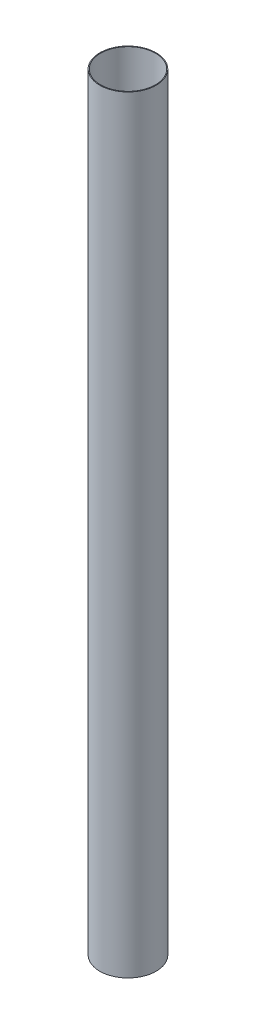
ISO-10303-21;
HEADER;
FILE_DESCRIPTION(('STEP AP214'),'2;1');
FILE_NAME('part.step','',(''),(''),'','','');
FILE_SCHEMA(('AUTOMOTIVE_DESIGN { 1 0 10303 214 1 1 1 1 }'));
ENDSEC;
DATA;
#1=APPLICATION_CONTEXT('core data for automotive mechanical design processes');
#2=APPLICATION_PROTOCOL_DEFINITION('international standard','automotive_design',2000,#1);
#3=PRODUCT_CONTEXT('',#1,'mechanical');
#4=PRODUCT('Part','Part','',(#3));
#5=PRODUCT_RELATED_PRODUCT_CATEGORY('part','',(#4));
#6=PRODUCT_DEFINITION_FORMATION('','',#4);
#7=PRODUCT_DEFINITION_CONTEXT('part definition',#1,'design');
#8=PRODUCT_DEFINITION('design','',#6,#7);
#9=PRODUCT_DEFINITION_SHAPE('','',#8);
#10=(LENGTH_UNIT() NAMED_UNIT(*) SI_UNIT(.MILLI.,.METRE.));
#11=(NAMED_UNIT(*) PLANE_ANGLE_UNIT() SI_UNIT($,.RADIAN.));
#12=(NAMED_UNIT(*) SI_UNIT($,.STERADIAN.) SOLID_ANGLE_UNIT());
#13=UNCERTAINTY_MEASURE_WITH_UNIT(LENGTH_MEASURE(1.E-05),#10,'distance_accuracy_value','');
#14=(GEOMETRIC_REPRESENTATION_CONTEXT(3) GLOBAL_UNCERTAINTY_ASSIGNED_CONTEXT((#13)) GLOBAL_UNIT_ASSIGNED_CONTEXT((#10,
#11,#12)) REPRESENTATION_CONTEXT('',''));
#15=CARTESIAN_POINT('',(0.,0.,0.));
#16=DIRECTION('',(0.,0.,1.));
#17=DIRECTION('',(1.,0.,0.));
#18=AXIS2_PLACEMENT_3D('',#15,#16,#17);
#19=CARTESIAN_POINT('',(0.,2133.6,0.));
#20=DIRECTION('',(0.,1.,0.));
#21=DIRECTION('',(0.,0.,1.));
#22=AXIS2_PLACEMENT_3D('',#19,#20,#21);
#23=PLANE('',#22);
#24=CARTESIAN_POINT('',(0.,2133.6,0.));
#25=DIRECTION('',(0.,1.,0.));
#26=DIRECTION('',(0.,0.,1.));
#27=AXIS2_PLACEMENT_3D('',#24,#25,#26);
#28=CIRCLE('',#27,78.359);
#29=CARTESIAN_POINT('',(0.,2133.6,78.359));
#30=VERTEX_POINT('',#29);
#31=EDGE_CURVE('E10',#30,#30,#28,.T.);
#32=ORIENTED_EDGE('',*,*,#31,.T.);
#33=EDGE_LOOP('',(#32));
#34=FACE_BOUND('',#33,.T.);
#35=CARTESIAN_POINT('',(0.,2133.6,0.));
#36=DIRECTION('',(0.,1.,0.));
#37=DIRECTION('',(0.,0.,1.));
#38=AXIS2_PLACEMENT_3D('',#35,#36,#37);
#39=CIRCLE('',#38,76.2);
#40=CARTESIAN_POINT('',(0.,2133.6,76.2));
#41=VERTEX_POINT('',#40);
#42=EDGE_CURVE('E43',#41,#41,#39,.T.);
#43=ORIENTED_EDGE('',*,*,#42,.F.);
#44=EDGE_LOOP('',(#43));
#45=FACE_BOUND('',#44,.T.);
#46=ADVANCED_FACE('F32',(#34,#45),#23,.T.);
#47=CARTESIAN_POINT('',(0.,0.,0.));
#48=DIRECTION('',(0.,1.,0.));
#49=DIRECTION('',(0.,0.,1.));
#50=AXIS2_PLACEMENT_3D('',#47,#48,#49);
#51=PLANE('',#50);
#52=CARTESIAN_POINT('',(0.,0.,0.));
#53=DIRECTION('',(0.,1.,0.));
#54=DIRECTION('',(0.,0.,1.));
#55=AXIS2_PLACEMENT_3D('',#52,#53,#54);
#56=CIRCLE('',#55,78.359);
#57=CARTESIAN_POINT('',(0.,0.,78.359));
#58=VERTEX_POINT('',#57);
#59=EDGE_CURVE('E36',#58,#58,#56,.T.);
#60=ORIENTED_EDGE('',*,*,#59,.F.);
#61=EDGE_LOOP('',(#60));
#62=FACE_BOUND('',#61,.T.);
#63=CARTESIAN_POINT('',(0.,0.,0.));
#64=DIRECTION('',(0.,1.,0.));
#65=DIRECTION('',(0.,0.,1.));
#66=AXIS2_PLACEMENT_3D('',#63,#64,#65);
#67=CIRCLE('',#66,76.2);
#68=CARTESIAN_POINT('',(0.,0.,76.2));
#69=VERTEX_POINT('',#68);
#70=EDGE_CURVE('E45',#69,#69,#67,.T.);
#71=ORIENTED_EDGE('',*,*,#70,.T.);
#72=EDGE_LOOP('',(#71));
#73=FACE_BOUND('',#72,.T.);
#74=ADVANCED_FACE('F55',(#62,#73),#51,.F.);
#75=CARTESIAN_POINT('',(0.,2133.6,0.));
#76=DIRECTION('',(0.,-1.,0.));
#77=DIRECTION('',(0.,0.,-1.));
#78=AXIS2_PLACEMENT_3D('',#75,#76,#77);
#79=CYLINDRICAL_SURFACE('',#78,78.359);
#80=ORIENTED_EDGE('',*,*,#31,.F.);
#81=EDGE_LOOP('',(#80));
#82=FACE_BOUND('',#81,.T.);
#83=ORIENTED_EDGE('',*,*,#59,.T.);
#84=EDGE_LOOP('',(#83));
#85=FACE_BOUND('',#84,.T.);
#86=ADVANCED_FACE('F34',(#82,#85),#79,.T.);
#87=CARTESIAN_POINT('',(0.,2133.6,0.));
#88=DIRECTION('',(0.,-1.,0.));
#89=DIRECTION('',(0.,0.,-1.));
#90=AXIS2_PLACEMENT_3D('',#87,#88,#89);
#91=CYLINDRICAL_SURFACE('',#90,76.2);
#92=ORIENTED_EDGE('',*,*,#42,.T.);
#93=EDGE_LOOP('',(#92));
#94=FACE_BOUND('',#93,.T.);
#95=ORIENTED_EDGE('',*,*,#70,.F.);
#96=EDGE_LOOP('',(#95));
#97=FACE_BOUND('',#96,.T.);
#98=ADVANCED_FACE('F51',(#94,#97),#91,.F.);
#99=CLOSED_SHELL('',(#46,#74,#86,#98));
#100=MANIFOLD_SOLID_BREP('B2',#99);
#101=ADVANCED_BREP_SHAPE_REPRESENTATION('',(#18,#100),#14);
#102=SHAPE_DEFINITION_REPRESENTATION(#9,#101);
ENDSEC;
END-ISO-10303-21;
